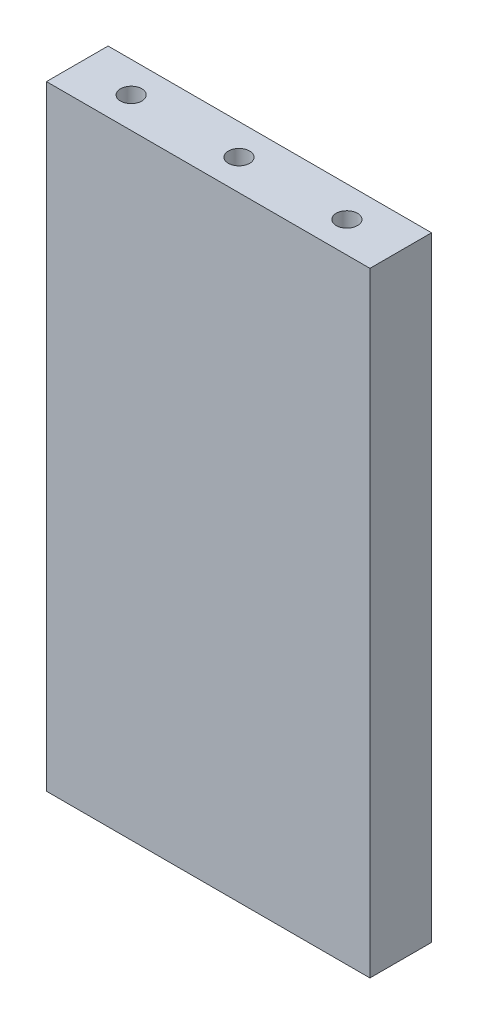
ISO-10303-21;
HEADER;
FILE_DESCRIPTION(('STEP AP214'),'2;1');
FILE_NAME('part.step','',(''),(''),'','','');
FILE_SCHEMA(('AUTOMOTIVE_DESIGN { 1 0 10303 214 1 1 1 1 }'));
ENDSEC;
DATA;
#1=APPLICATION_CONTEXT('core data for automotive mechanical design processes');
#2=APPLICATION_PROTOCOL_DEFINITION('international standard','automotive_design',2000,#1);
#3=PRODUCT_CONTEXT('',#1,'mechanical');
#4=PRODUCT('Part','Part','',(#3));
#5=PRODUCT_RELATED_PRODUCT_CATEGORY('part','',(#4));
#6=PRODUCT_DEFINITION_FORMATION('','',#4);
#7=PRODUCT_DEFINITION_CONTEXT('part definition',#1,'design');
#8=PRODUCT_DEFINITION('design','',#6,#7);
#9=PRODUCT_DEFINITION_SHAPE('','',#8);
#10=(LENGTH_UNIT() NAMED_UNIT(*) SI_UNIT(.MILLI.,.METRE.));
#11=(NAMED_UNIT(*) PLANE_ANGLE_UNIT() SI_UNIT($,.RADIAN.));
#12=(NAMED_UNIT(*) SI_UNIT($,.STERADIAN.) SOLID_ANGLE_UNIT());
#13=UNCERTAINTY_MEASURE_WITH_UNIT(LENGTH_MEASURE(1.E-05),#10,'distance_accuracy_value','');
#14=(GEOMETRIC_REPRESENTATION_CONTEXT(3) GLOBAL_UNCERTAINTY_ASSIGNED_CONTEXT((#13)) GLOBAL_UNIT_ASSIGNED_CONTEXT((#10,
#11,#12)) REPRESENTATION_CONTEXT('',''));
#15=CARTESIAN_POINT('',(0.,0.,0.));
#16=DIRECTION('',(0.,0.,1.));
#17=DIRECTION('',(1.,0.,0.));
#18=AXIS2_PLACEMENT_3D('',#15,#16,#17);
#19=CARTESIAN_POINT('',(25.,-47.5,-9.525));
#20=DIRECTION('',(1.,0.,0.));
#21=DIRECTION('',(0.,0.,-1.));
#22=AXIS2_PLACEMENT_3D('',#19,#20,#21);
#23=PLANE('',#22);
#24=DIRECTION('',(0.,1.,0.));
#25=VECTOR('',#24,1.);
#26=CARTESIAN_POINT('',(25.,-47.5,0.));
#27=LINE('',#26,#25);
#28=CARTESIAN_POINT('',(25.,-47.5,0.));
#29=VERTEX_POINT('',#28);
#30=CARTESIAN_POINT('',(25.,47.5,0.));
#31=VERTEX_POINT('',#30);
#32=EDGE_CURVE('E167',#29,#31,#27,.T.);
#33=ORIENTED_EDGE('',*,*,#32,.F.);
#34=DIRECTION('',(0.,0.,1.));
#35=VECTOR('',#34,1.);
#36=CARTESIAN_POINT('',(25.,-47.5,-9.525));
#37=LINE('',#36,#35);
#38=CARTESIAN_POINT('',(25.,-47.5,-9.525));
#39=VERTEX_POINT('',#38);
#40=EDGE_CURVE('E11',#39,#29,#37,.T.);
#41=ORIENTED_EDGE('',*,*,#40,.F.);
#42=DIRECTION('',(0.,1.,0.));
#43=VECTOR('',#42,1.);
#44=CARTESIAN_POINT('',(25.,-47.5,-9.525));
#45=LINE('',#44,#43);
#46=CARTESIAN_POINT('',(25.,47.5,-9.525));
#47=VERTEX_POINT('',#46);
#48=EDGE_CURVE('E168',#39,#47,#45,.T.);
#49=ORIENTED_EDGE('',*,*,#48,.T.);
#50=DIRECTION('',(0.,0.,1.));
#51=VECTOR('',#50,1.);
#52=CARTESIAN_POINT('',(25.,47.5,-9.525));
#53=LINE('',#52,#51);
#54=EDGE_CURVE('E48',#47,#31,#53,.T.);
#55=ORIENTED_EDGE('',*,*,#54,.T.);
#56=EDGE_LOOP('',(#33,#41,#49,#55));
#57=FACE_BOUND('',#56,.T.);
#58=ADVANCED_FACE('F45',(#57),#23,.T.);
#59=CARTESIAN_POINT('',(-25.,-47.5,-9.525));
#60=DIRECTION('',(0.,-1.,0.));
#61=DIRECTION('',(0.,0.,-1.));
#62=AXIS2_PLACEMENT_3D('',#59,#60,#61);
#63=PLANE('',#62);
#64=CARTESIAN_POINT('',(16.67,-47.5,-4.7625));
#65=DIRECTION('',(0.,-1.,0.));
#66=DIRECTION('',(0.,0.,-1.));
#67=AXIS2_PLACEMENT_3D('',#64,#65,#66);
#68=CIRCLE('',#67,1.65);
#69=CARTESIAN_POINT('',(16.67,-47.5,-6.4125));
#70=VERTEX_POINT('',#69);
#71=EDGE_CURVE('E143',#70,#70,#68,.T.);
#72=ORIENTED_EDGE('',*,*,#71,.F.);
#73=EDGE_LOOP('',(#72));
#74=FACE_BOUND('',#73,.T.);
#75=CARTESIAN_POINT('',(0.,-47.5,-4.7625));
#76=DIRECTION('',(0.,-1.,0.));
#77=DIRECTION('',(0.,0.,-1.));
#78=AXIS2_PLACEMENT_3D('',#75,#76,#77);
#79=CIRCLE('',#78,1.65);
#80=CARTESIAN_POINT('',(0.,-47.5,-6.4125));
#81=VERTEX_POINT('',#80);
#82=EDGE_CURVE('E151',#81,#81,#79,.T.);
#83=ORIENTED_EDGE('',*,*,#82,.F.);
#84=EDGE_LOOP('',(#83));
#85=FACE_BOUND('',#84,.T.);
#86=CARTESIAN_POINT('',(-16.67,-47.5,-4.7625));
#87=DIRECTION('',(0.,-1.,0.));
#88=DIRECTION('',(0.,0.,-1.));
#89=AXIS2_PLACEMENT_3D('',#86,#87,#88);
#90=CIRCLE('',#89,1.65);
#91=CARTESIAN_POINT('',(-16.67,-47.5,-6.4125));
#92=VERTEX_POINT('',#91);
#93=EDGE_CURVE('E159',#92,#92,#90,.T.);
#94=ORIENTED_EDGE('',*,*,#93,.F.);
#95=EDGE_LOOP('',(#94));
#96=FACE_BOUND('',#95,.T.);
#97=DIRECTION('',(1.,0.,0.));
#98=VECTOR('',#97,1.);
#99=CARTESIAN_POINT('',(-25.,-47.5,0.));
#100=LINE('',#99,#98);
#101=CARTESIAN_POINT('',(-25.,-47.5,0.));
#102=VERTEX_POINT('',#101);
#103=EDGE_CURVE('E172',#102,#29,#100,.T.);
#104=ORIENTED_EDGE('',*,*,#103,.F.);
#105=DIRECTION('',(0.,0.,1.));
#106=VECTOR('',#105,1.);
#107=CARTESIAN_POINT('',(-25.,-47.5,-9.525));
#108=LINE('',#107,#106);
#109=CARTESIAN_POINT('',(-25.,-47.5,-9.525));
#110=VERTEX_POINT('',#109);
#111=EDGE_CURVE('E55',#110,#102,#108,.T.);
#112=ORIENTED_EDGE('',*,*,#111,.F.);
#113=DIRECTION('',(1.,0.,0.));
#114=VECTOR('',#113,1.);
#115=CARTESIAN_POINT('',(-25.,-47.5,-9.525));
#116=LINE('',#115,#114);
#117=EDGE_CURVE('E178',#110,#39,#116,.T.);
#118=ORIENTED_EDGE('',*,*,#117,.T.);
#119=ORIENTED_EDGE('',*,*,#40,.T.);
#120=EDGE_LOOP('',(#104,#112,#118,#119));
#121=FACE_BOUND('',#120,.T.);
#122=ADVANCED_FACE('F201',(#74,#85,#96,#121),#63,.T.);
#123=CARTESIAN_POINT('',(-25.,-47.5,-9.525));
#124=DIRECTION('',(-1.,0.,0.));
#125=DIRECTION('',(0.,0.,1.));
#126=AXIS2_PLACEMENT_3D('',#123,#124,#125);
#127=PLANE('',#126);
#128=DIRECTION('',(0.,-1.,0.));
#129=VECTOR('',#128,1.);
#130=CARTESIAN_POINT('',(-25.,-47.5,0.));
#131=LINE('',#130,#129);
#132=CARTESIAN_POINT('',(-25.,47.5,0.));
#133=VERTEX_POINT('',#132);
#134=EDGE_CURVE('E188',#133,#102,#131,.T.);
#135=ORIENTED_EDGE('',*,*,#134,.F.);
#136=DIRECTION('',(0.,0.,1.));
#137=VECTOR('',#136,1.);
#138=CARTESIAN_POINT('',(-25.,47.5,-9.525));
#139=LINE('',#138,#137);
#140=CARTESIAN_POINT('',(-25.,47.5,-9.525));
#141=VERTEX_POINT('',#140);
#142=EDGE_CURVE('E195',#141,#133,#139,.T.);
#143=ORIENTED_EDGE('',*,*,#142,.F.);
#144=DIRECTION('',(0.,-1.,0.));
#145=VECTOR('',#144,1.);
#146=CARTESIAN_POINT('',(-25.,-47.5,-9.525));
#147=LINE('',#146,#145);
#148=EDGE_CURVE('E175',#141,#110,#147,.T.);
#149=ORIENTED_EDGE('',*,*,#148,.T.);
#150=ORIENTED_EDGE('',*,*,#111,.T.);
#151=EDGE_LOOP('',(#135,#143,#149,#150));
#152=FACE_BOUND('',#151,.T.);
#153=ADVANCED_FACE('F204',(#152),#127,.T.);
#154=CARTESIAN_POINT('',(-25.,47.5,-9.525));
#155=DIRECTION('',(0.,1.,0.));
#156=DIRECTION('',(0.,0.,1.));
#157=AXIS2_PLACEMENT_3D('',#154,#155,#156);
#158=PLANE('',#157);
#159=CARTESIAN_POINT('',(0.,47.5,-4.7625));
#160=DIRECTION('',(0.,1.,0.));
#161=DIRECTION('',(0.,0.,1.));
#162=AXIS2_PLACEMENT_3D('',#159,#160,#161);
#163=CIRCLE('',#162,1.65);
#164=CARTESIAN_POINT('',(0.,47.5,-3.1125));
#165=VERTEX_POINT('',#164);
#166=EDGE_CURVE('E122',#165,#165,#163,.T.);
#167=ORIENTED_EDGE('',*,*,#166,.F.);
#168=EDGE_LOOP('',(#167));
#169=FACE_BOUND('',#168,.T.);
#170=CARTESIAN_POINT('',(16.67,47.5,-4.7625));
#171=DIRECTION('',(0.,1.,0.));
#172=DIRECTION('',(0.,0.,1.));
#173=AXIS2_PLACEMENT_3D('',#170,#171,#172);
#174=CIRCLE('',#173,1.65);
#175=CARTESIAN_POINT('',(16.67,47.5,-3.1125));
#176=VERTEX_POINT('',#175);
#177=EDGE_CURVE('E121',#176,#176,#174,.T.);
#178=ORIENTED_EDGE('',*,*,#177,.F.);
#179=EDGE_LOOP('',(#178));
#180=FACE_BOUND('',#179,.T.);
#181=CARTESIAN_POINT('',(-16.67,47.5,-4.7625));
#182=DIRECTION('',(0.,1.,0.));
#183=DIRECTION('',(0.,0.,1.));
#184=AXIS2_PLACEMENT_3D('',#181,#182,#183);
#185=CIRCLE('',#184,1.65);
#186=CARTESIAN_POINT('',(-16.67,47.5,-3.1125));
#187=VERTEX_POINT('',#186);
#188=EDGE_CURVE('E135',#187,#187,#185,.T.);
#189=ORIENTED_EDGE('',*,*,#188,.F.);
#190=EDGE_LOOP('',(#189));
#191=FACE_BOUND('',#190,.T.);
#192=DIRECTION('',(-1.,0.,0.));
#193=VECTOR('',#192,1.);
#194=CARTESIAN_POINT('',(-25.,47.5,0.));
#195=LINE('',#194,#193);
#196=EDGE_CURVE('E184',#31,#133,#195,.T.);
#197=ORIENTED_EDGE('',*,*,#196,.F.);
#198=ORIENTED_EDGE('',*,*,#54,.F.);
#199=DIRECTION('',(-1.,0.,0.));
#200=VECTOR('',#199,1.);
#201=CARTESIAN_POINT('',(-25.,47.5,-9.525));
#202=LINE('',#201,#200);
#203=EDGE_CURVE('E171',#47,#141,#202,.T.);
#204=ORIENTED_EDGE('',*,*,#203,.T.);
#205=ORIENTED_EDGE('',*,*,#142,.T.);
#206=EDGE_LOOP('',(#197,#198,#204,#205));
#207=FACE_BOUND('',#206,.T.);
#208=ADVANCED_FACE('F198',(#169,#180,#191,#207),#158,.T.);
#209=CARTESIAN_POINT('',(0.,0.,-9.525));
#210=DIRECTION('',(0.,0.,-1.));
#211=DIRECTION('',(-1.,0.,0.));
#212=AXIS2_PLACEMENT_3D('',#209,#210,#211);
#213=PLANE('',#212);
#214=ORIENTED_EDGE('',*,*,#48,.F.);
#215=ORIENTED_EDGE('',*,*,#117,.F.);
#216=ORIENTED_EDGE('',*,*,#148,.F.);
#217=ORIENTED_EDGE('',*,*,#203,.F.);
#218=EDGE_LOOP('',(#214,#215,#216,#217));
#219=FACE_BOUND('',#218,.T.);
#220=ADVANCED_FACE('F206',(#219),#213,.T.);
#221=CARTESIAN_POINT('',(0.,0.,0.));
#222=DIRECTION('',(0.,0.,-1.));
#223=DIRECTION('',(-1.,0.,0.));
#224=AXIS2_PLACEMENT_3D('',#221,#222,#223);
#225=PLANE('',#224);
#226=ORIENTED_EDGE('',*,*,#32,.T.);
#227=ORIENTED_EDGE('',*,*,#196,.T.);
#228=ORIENTED_EDGE('',*,*,#134,.T.);
#229=ORIENTED_EDGE('',*,*,#103,.T.);
#230=EDGE_LOOP('',(#226,#227,#228,#229));
#231=FACE_BOUND('',#230,.T.);
#232=ADVANCED_FACE('F200',(#231),#225,.F.);
#233=CARTESIAN_POINT('',(-16.67,-44.3,-4.7625));
#234=DIRECTION('',(0.,-1.,0.));
#235=DIRECTION('',(0.,0.,-1.));
#236=AXIS2_PLACEMENT_3D('',#233,#234,#235);
#237=CONICAL_SURFACE('',#236,1.65,1.02974425867665);
#238=CARTESIAN_POINT('',(-16.67,-43.3085799786045,-4.7625));
#239=VERTEX_POINT('',#238);
#240=VERTEX_LOOP('',#239);
#241=FACE_BOUND('',#240,.T.);
#242=CARTESIAN_POINT('',(-16.67,-44.3,-4.7625));
#243=DIRECTION('',(0.,-1.,0.));
#244=DIRECTION('',(0.,0.,-1.));
#245=AXIS2_PLACEMENT_3D('',#242,#243,#244);
#246=CIRCLE('',#245,1.65);
#247=CARTESIAN_POINT('',(-16.67,-44.3,-6.4125));
#248=VERTEX_POINT('',#247);
#249=EDGE_CURVE('E163',#248,#248,#246,.T.);
#250=ORIENTED_EDGE('',*,*,#249,.T.);
#251=EDGE_LOOP('',(#250));
#252=FACE_BOUND('',#251,.T.);
#253=ADVANCED_FACE('F213',(#241,#252),#237,.F.);
#254=CARTESIAN_POINT('',(-16.67,-47.5,-4.7625));
#255=DIRECTION('',(0.,-1.,0.));
#256=DIRECTION('',(0.,0.,-1.));
#257=AXIS2_PLACEMENT_3D('',#254,#255,#256);
#258=CYLINDRICAL_SURFACE('',#257,1.65);
#259=ORIENTED_EDGE('',*,*,#249,.F.);
#260=EDGE_LOOP('',(#259));
#261=FACE_BOUND('',#260,.T.);
#262=ORIENTED_EDGE('',*,*,#93,.T.);
#263=EDGE_LOOP('',(#262));
#264=FACE_BOUND('',#263,.T.);
#265=ADVANCED_FACE('F234',(#261,#264),#258,.F.);
#266=CARTESIAN_POINT('',(0.,-44.3,-4.7625));
#267=DIRECTION('',(0.,-1.,0.));
#268=DIRECTION('',(0.,0.,-1.));
#269=AXIS2_PLACEMENT_3D('',#266,#267,#268);
#270=CONICAL_SURFACE('',#269,1.65,1.02974425867665);
#271=CARTESIAN_POINT('',(0.,-43.3085799786045,-4.7625));
#272=VERTEX_POINT('',#271);
#273=VERTEX_LOOP('',#272);
#274=FACE_BOUND('',#273,.T.);
#275=CARTESIAN_POINT('',(0.,-44.3,-4.7625));
#276=DIRECTION('',(0.,-1.,0.));
#277=DIRECTION('',(0.,0.,-1.));
#278=AXIS2_PLACEMENT_3D('',#275,#276,#277);
#279=CIRCLE('',#278,1.65);
#280=CARTESIAN_POINT('',(0.,-44.3,-6.4125));
#281=VERTEX_POINT('',#280);
#282=EDGE_CURVE('E155',#281,#281,#279,.T.);
#283=ORIENTED_EDGE('',*,*,#282,.T.);
#284=EDGE_LOOP('',(#283));
#285=FACE_BOUND('',#284,.T.);
#286=ADVANCED_FACE('F236',(#274,#285),#270,.F.);
#287=CARTESIAN_POINT('',(0.,-47.5,-4.7625));
#288=DIRECTION('',(0.,-1.,0.));
#289=DIRECTION('',(0.,0.,-1.));
#290=AXIS2_PLACEMENT_3D('',#287,#288,#289);
#291=CYLINDRICAL_SURFACE('',#290,1.65);
#292=ORIENTED_EDGE('',*,*,#282,.F.);
#293=EDGE_LOOP('',(#292));
#294=FACE_BOUND('',#293,.T.);
#295=ORIENTED_EDGE('',*,*,#82,.T.);
#296=EDGE_LOOP('',(#295));
#297=FACE_BOUND('',#296,.T.);
#298=ADVANCED_FACE('F242',(#294,#297),#291,.F.);
#299=CARTESIAN_POINT('',(16.67,-44.3,-4.7625));
#300=DIRECTION('',(0.,-1.,0.));
#301=DIRECTION('',(0.,0.,-1.));
#302=AXIS2_PLACEMENT_3D('',#299,#300,#301);
#303=CONICAL_SURFACE('',#302,1.65,1.02974425867665);
#304=CARTESIAN_POINT('',(16.67,-43.3085799786045,-4.7625));
#305=VERTEX_POINT('',#304);
#306=VERTEX_LOOP('',#305);
#307=FACE_BOUND('',#306,.T.);
#308=CARTESIAN_POINT('',(16.67,-44.3,-4.7625));
#309=DIRECTION('',(0.,-1.,0.));
#310=DIRECTION('',(0.,0.,-1.));
#311=AXIS2_PLACEMENT_3D('',#308,#309,#310);
#312=CIRCLE('',#311,1.65);
#313=CARTESIAN_POINT('',(16.67,-44.3,-6.4125));
#314=VERTEX_POINT('',#313);
#315=EDGE_CURVE('E147',#314,#314,#312,.T.);
#316=ORIENTED_EDGE('',*,*,#315,.T.);
#317=EDGE_LOOP('',(#316));
#318=FACE_BOUND('',#317,.T.);
#319=ADVANCED_FACE('F250',(#307,#318),#303,.F.);
#320=CARTESIAN_POINT('',(16.67,-47.5,-4.7625));
#321=DIRECTION('',(0.,-1.,0.));
#322=DIRECTION('',(0.,0.,-1.));
#323=AXIS2_PLACEMENT_3D('',#320,#321,#322);
#324=CYLINDRICAL_SURFACE('',#323,1.65);
#325=ORIENTED_EDGE('',*,*,#315,.F.);
#326=EDGE_LOOP('',(#325));
#327=FACE_BOUND('',#326,.T.);
#328=ORIENTED_EDGE('',*,*,#71,.T.);
#329=EDGE_LOOP('',(#328));
#330=FACE_BOUND('',#329,.T.);
#331=ADVANCED_FACE('F254',(#327,#330),#324,.F.);
#332=CARTESIAN_POINT('',(-16.67,44.3,-4.7625));
#333=DIRECTION('',(0.,1.,0.));
#334=DIRECTION('',(0.,0.,1.));
#335=AXIS2_PLACEMENT_3D('',#332,#333,#334);
#336=CONICAL_SURFACE('',#335,1.65,1.02974425867665);
#337=CARTESIAN_POINT('',(-16.67,43.3085799786045,-4.7625));
#338=VERTEX_POINT('',#337);
#339=VERTEX_LOOP('',#338);
#340=FACE_BOUND('',#339,.T.);
#341=CARTESIAN_POINT('',(-16.67,44.3,-4.7625));
#342=DIRECTION('',(0.,1.,0.));
#343=DIRECTION('',(0.,0.,1.));
#344=AXIS2_PLACEMENT_3D('',#341,#342,#343);
#345=CIRCLE('',#344,1.65);
#346=CARTESIAN_POINT('',(-16.67,44.3,-3.1125));
#347=VERTEX_POINT('',#346);
#348=EDGE_CURVE('E139',#347,#347,#345,.T.);
#349=ORIENTED_EDGE('',*,*,#348,.T.);
#350=EDGE_LOOP('',(#349));
#351=FACE_BOUND('',#350,.T.);
#352=ADVANCED_FACE('F258',(#340,#351),#336,.F.);
#353=CARTESIAN_POINT('',(-16.67,47.5,-4.7625));
#354=DIRECTION('',(0.,1.,0.));
#355=DIRECTION('',(0.,0.,1.));
#356=AXIS2_PLACEMENT_3D('',#353,#354,#355);
#357=CYLINDRICAL_SURFACE('',#356,1.65);
#358=ORIENTED_EDGE('',*,*,#348,.F.);
#359=EDGE_LOOP('',(#358));
#360=FACE_BOUND('',#359,.T.);
#361=ORIENTED_EDGE('',*,*,#188,.T.);
#362=EDGE_LOOP('',(#361));
#363=FACE_BOUND('',#362,.T.);
#364=ADVANCED_FACE('F262',(#360,#363),#357,.F.);
#365=CARTESIAN_POINT('',(16.67,44.3,-4.7625));
#366=DIRECTION('',(0.,1.,0.));
#367=DIRECTION('',(0.,0.,1.));
#368=AXIS2_PLACEMENT_3D('',#365,#366,#367);
#369=CONICAL_SURFACE('',#368,1.65,1.02974425867665);
#370=CARTESIAN_POINT('',(16.67,43.3085799786045,-4.7625));
#371=VERTEX_POINT('',#370);
#372=VERTEX_LOOP('',#371);
#373=FACE_BOUND('',#372,.T.);
#374=CARTESIAN_POINT('',(16.67,44.3,-4.7625));
#375=DIRECTION('',(0.,1.,0.));
#376=DIRECTION('',(0.,0.,1.));
#377=AXIS2_PLACEMENT_3D('',#374,#375,#376);
#378=CIRCLE('',#377,1.65);
#379=CARTESIAN_POINT('',(16.67,44.3,-3.1125));
#380=VERTEX_POINT('',#379);
#381=EDGE_CURVE('E127',#380,#380,#378,.T.);
#382=ORIENTED_EDGE('',*,*,#381,.T.);
#383=EDGE_LOOP('',(#382));
#384=FACE_BOUND('',#383,.T.);
#385=ADVANCED_FACE('F266',(#373,#384),#369,.F.);
#386=CARTESIAN_POINT('',(16.67,47.5,-4.7625));
#387=DIRECTION('',(0.,1.,0.));
#388=DIRECTION('',(0.,0.,1.));
#389=AXIS2_PLACEMENT_3D('',#386,#387,#388);
#390=CYLINDRICAL_SURFACE('',#389,1.65);
#391=ORIENTED_EDGE('',*,*,#381,.F.);
#392=EDGE_LOOP('',(#391));
#393=FACE_BOUND('',#392,.T.);
#394=ORIENTED_EDGE('',*,*,#177,.T.);
#395=EDGE_LOOP('',(#394));
#396=FACE_BOUND('',#395,.T.);
#397=ADVANCED_FACE('F114',(#393,#396),#390,.F.);
#398=CARTESIAN_POINT('',(0.,44.3,-4.7625));
#399=DIRECTION('',(0.,1.,0.));
#400=DIRECTION('',(0.,0.,1.));
#401=AXIS2_PLACEMENT_3D('',#398,#399,#400);
#402=CONICAL_SURFACE('',#401,1.65,1.02974425867665);
#403=CARTESIAN_POINT('',(0.,43.3085799786045,-4.7625));
#404=VERTEX_POINT('',#403);
#405=VERTEX_LOOP('',#404);
#406=FACE_BOUND('',#405,.T.);
#407=CARTESIAN_POINT('',(0.,44.3,-4.7625));
#408=DIRECTION('',(0.,1.,0.));
#409=DIRECTION('',(0.,0.,1.));
#410=AXIS2_PLACEMENT_3D('',#407,#408,#409);
#411=CIRCLE('',#410,1.65);
#412=CARTESIAN_POINT('',(0.,44.3,-3.1125));
#413=VERTEX_POINT('',#412);
#414=EDGE_CURVE('E118',#413,#413,#411,.T.);
#415=ORIENTED_EDGE('',*,*,#414,.T.);
#416=EDGE_LOOP('',(#415));
#417=FACE_BOUND('',#416,.T.);
#418=ADVANCED_FACE('F110',(#406,#417),#402,.F.);
#419=CARTESIAN_POINT('',(0.,47.5,-4.7625));
#420=DIRECTION('',(0.,1.,0.));
#421=DIRECTION('',(0.,0.,1.));
#422=AXIS2_PLACEMENT_3D('',#419,#420,#421);
#423=CYLINDRICAL_SURFACE('',#422,1.65);
#424=ORIENTED_EDGE('',*,*,#414,.F.);
#425=EDGE_LOOP('',(#424));
#426=FACE_BOUND('',#425,.T.);
#427=ORIENTED_EDGE('',*,*,#166,.T.);
#428=EDGE_LOOP('',(#427));
#429=FACE_BOUND('',#428,.T.);
#430=ADVANCED_FACE('F113',(#426,#429),#423,.F.);
#431=CLOSED_SHELL('',(#58,#122,#153,#208,#220,#232,#253,#265,#286,#298,#319,#331,#352,#364,#385,
#397,#418,#430));
#432=MANIFOLD_SOLID_BREP('B2',#431);
#433=ADVANCED_BREP_SHAPE_REPRESENTATION('',(#18,#432),#14);
#434=SHAPE_DEFINITION_REPRESENTATION(#9,#433);
ENDSEC;
END-ISO-10303-21;
